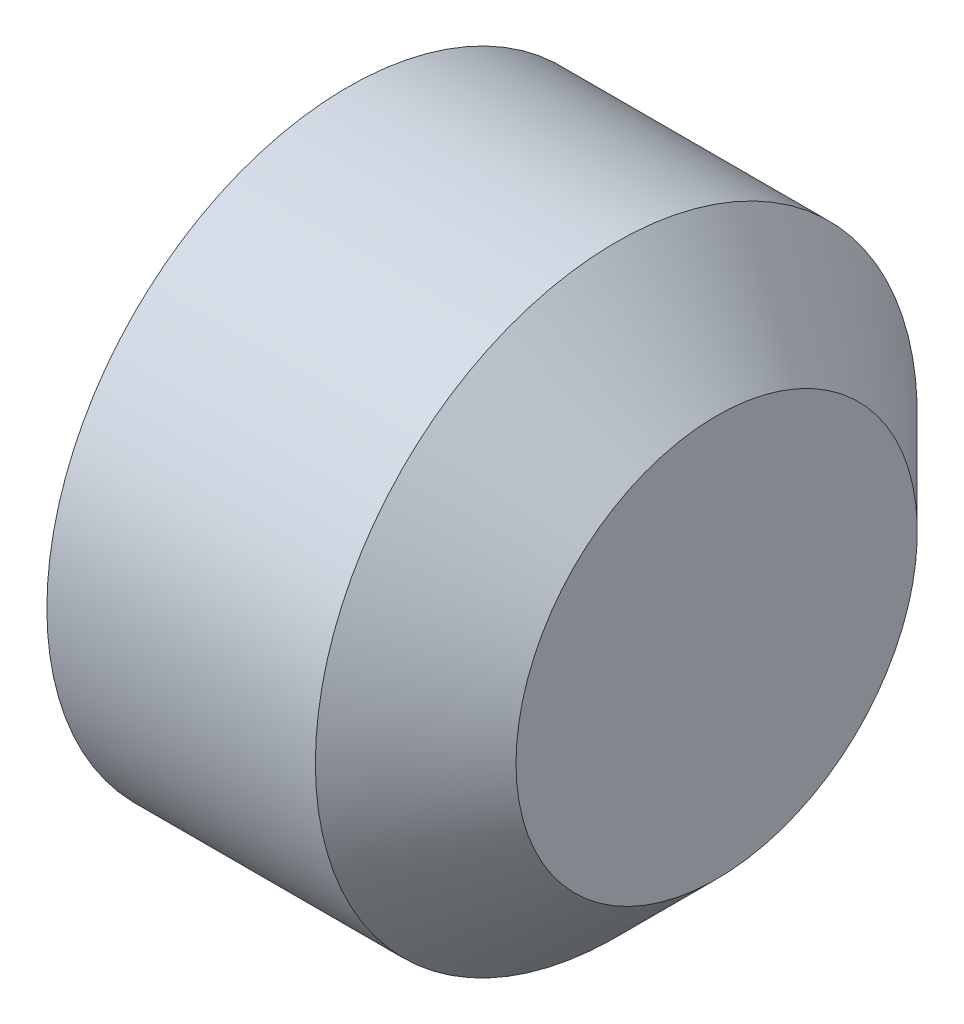
ISO-10303-21;
HEADER;
FILE_DESCRIPTION(('STEP AP214'),'2;1');
FILE_NAME('part.step','',(''),(''),'','','');
FILE_SCHEMA(('AUTOMOTIVE_DESIGN { 1 0 10303 214 1 1 1 1 }'));
ENDSEC;
DATA;
#1=APPLICATION_CONTEXT('core data for automotive mechanical design processes');
#2=APPLICATION_PROTOCOL_DEFINITION('international standard','automotive_design',2000,#1);
#3=PRODUCT_CONTEXT('',#1,'mechanical');
#4=PRODUCT('Part','Part','',(#3));
#5=PRODUCT_RELATED_PRODUCT_CATEGORY('part','',(#4));
#6=PRODUCT_DEFINITION_FORMATION('','',#4);
#7=PRODUCT_DEFINITION_CONTEXT('part definition',#1,'design');
#8=PRODUCT_DEFINITION('design','',#6,#7);
#9=PRODUCT_DEFINITION_SHAPE('','',#8);
#10=(LENGTH_UNIT() NAMED_UNIT(*) SI_UNIT(.MILLI.,.METRE.));
#11=(NAMED_UNIT(*) PLANE_ANGLE_UNIT() SI_UNIT($,.RADIAN.));
#12=(NAMED_UNIT(*) SI_UNIT($,.STERADIAN.) SOLID_ANGLE_UNIT());
#13=UNCERTAINTY_MEASURE_WITH_UNIT(LENGTH_MEASURE(1.E-05),#10,'distance_accuracy_value','');
#14=(GEOMETRIC_REPRESENTATION_CONTEXT(3) GLOBAL_UNCERTAINTY_ASSIGNED_CONTEXT((#13)) GLOBAL_UNIT_ASSIGNED_CONTEXT((#10,
#11,#12)) REPRESENTATION_CONTEXT('',''));
#15=CARTESIAN_POINT('',(0.,0.,0.));
#16=DIRECTION('',(0.,0.,1.));
#17=DIRECTION('',(1.,0.,0.));
#18=AXIS2_PLACEMENT_3D('',#15,#16,#17);
#19=CARTESIAN_POINT('',(0.,0.,0.));
#20=DIRECTION('',(-1.,0.,0.));
#21=DIRECTION('',(0.,0.,1.));
#22=AXIS2_PLACEMENT_3D('',#19,#20,#21);
#23=PLANE('',#22);
#24=CARTESIAN_POINT('',(0.,0.,0.));
#25=DIRECTION('',(-1.,0.,0.));
#26=DIRECTION('',(0.,0.,1.));
#27=AXIS2_PLACEMENT_3D('',#24,#25,#26);
#28=CIRCLE('',#27,1.2195);
#29=CARTESIAN_POINT('',(0.,0.,1.2195));
#30=VERTEX_POINT('',#29);
#31=EDGE_CURVE('E11',#30,#30,#28,.T.);
#32=ORIENTED_EDGE('',*,*,#31,.T.);
#33=EDGE_LOOP('',(#32));
#34=FACE_BOUND('',#33,.T.);
#35=DIRECTION('',(0.,0.,-1.));
#36=VECTOR('',#35,1.);
#37=CARTESIAN_POINT('',(0.,0.750000000000003,0.433012701892217));
#38=LINE('',#37,#36);
#39=CARTESIAN_POINT('',(0.,0.750000000000003,0.433012701892217));
#40=VERTEX_POINT('',#39);
#41=CARTESIAN_POINT('',(0.,0.750000000000003,-0.433012701892221));
#42=VERTEX_POINT('',#41);
#43=EDGE_CURVE('E127',#40,#42,#38,.T.);
#44=ORIENTED_EDGE('',*,*,#43,.F.);
#45=DIRECTION('',(0.,-0.866025403784439,0.5));
#46=VECTOR('',#45,1.);
#47=CARTESIAN_POINT('',(0.,0.750000000000003,0.433012701892217));
#48=LINE('',#47,#46);
#49=CARTESIAN_POINT('',(0.,0.,0.866025403784436));
#50=VERTEX_POINT('',#49);
#51=EDGE_CURVE('E49',#40,#50,#48,.T.);
#52=ORIENTED_EDGE('',*,*,#51,.T.);
#53=DIRECTION('',(0.,0.866025403784439,0.5));
#54=VECTOR('',#53,1.);
#55=CARTESIAN_POINT('',(0.,-0.749999999999997,0.433012701892217));
#56=LINE('',#55,#54);
#57=CARTESIAN_POINT('',(0.,-0.749999999999997,0.433012701892217));
#58=VERTEX_POINT('',#57);
#59=EDGE_CURVE('E118',#58,#50,#56,.T.);
#60=ORIENTED_EDGE('',*,*,#59,.F.);
#61=DIRECTION('',(0.,0.,-1.));
#62=VECTOR('',#61,1.);
#63=CARTESIAN_POINT('',(0.,-0.749999999999997,0.433012701892217));
#64=LINE('',#63,#62);
#65=CARTESIAN_POINT('',(0.,-0.749999999999997,-0.433012701892222));
#66=VERTEX_POINT('',#65);
#67=EDGE_CURVE('E121',#58,#66,#64,.T.);
#68=ORIENTED_EDGE('',*,*,#67,.T.);
#69=DIRECTION('',(0.,0.866025403784439,-0.5));
#70=VECTOR('',#69,1.);
#71=CARTESIAN_POINT('',(0.,-0.749999999999997,-0.433012701892222));
#72=LINE('',#71,#70);
#73=CARTESIAN_POINT('',(0.,0.,-0.866025403784441));
#74=VERTEX_POINT('',#73);
#75=EDGE_CURVE('E124',#66,#74,#72,.T.);
#76=ORIENTED_EDGE('',*,*,#75,.T.);
#77=DIRECTION('',(0.,-0.866025403784439,-0.5));
#78=VECTOR('',#77,1.);
#79=CARTESIAN_POINT('',(0.,0.750000000000003,-0.433012701892221));
#80=LINE('',#79,#78);
#81=EDGE_CURVE('E107',#42,#74,#80,.T.);
#82=ORIENTED_EDGE('',*,*,#81,.F.);
#83=EDGE_LOOP('',(#44,#52,#60,#68,#76,#82));
#84=FACE_BOUND('',#83,.T.);
#85=ADVANCED_FACE('F35',(#34,#84),#23,.T.);
#86=CARTESIAN_POINT('',(0.,0.,0.));
#87=DIRECTION('',(1.,0.,0.));
#88=DIRECTION('',(0.,0.,-1.));
#89=AXIS2_PLACEMENT_3D('',#86,#87,#88);
#90=CONICAL_SURFACE('',#89,1.2195,1.0471975511966);
#91=CARTESIAN_POINT('',(0.161946750507689,0.,0.));
#92=DIRECTION('',(-1.,0.,0.));
#93=DIRECTION('',(0.,0.,1.));
#94=AXIS2_PLACEMENT_3D('',#91,#92,#93);
#95=CIRCLE('',#94,1.5);
#96=CARTESIAN_POINT('',(0.161946750507689,0.,1.5));
#97=VERTEX_POINT('',#96);
#98=EDGE_CURVE('E42',#97,#97,#95,.T.);
#99=ORIENTED_EDGE('',*,*,#98,.T.);
#100=EDGE_LOOP('',(#99));
#101=FACE_BOUND('',#100,.T.);
#102=ORIENTED_EDGE('',*,*,#31,.F.);
#103=EDGE_LOOP('',(#102));
#104=FACE_BOUND('',#103,.T.);
#105=ADVANCED_FACE('F144',(#101,#104),#90,.T.);
#106=CARTESIAN_POINT('',(-12.7,0.,0.));
#107=DIRECTION('',(-1.,0.,0.));
#108=DIRECTION('',(0.,0.,1.));
#109=AXIS2_PLACEMENT_3D('',#106,#107,#108);
#110=CYLINDRICAL_SURFACE('',#109,1.5);
#111=CARTESIAN_POINT('',(1.5,0.,0.));
#112=DIRECTION('',(-1.,0.,0.));
#113=DIRECTION('',(0.,0.,1.));
#114=AXIS2_PLACEMENT_3D('',#111,#112,#113);
#115=CIRCLE('',#114,1.5);
#116=CARTESIAN_POINT('',(1.5,0.,1.5));
#117=VERTEX_POINT('',#116);
#118=EDGE_CURVE('E139',#117,#117,#115,.T.);
#119=ORIENTED_EDGE('',*,*,#118,.T.);
#120=EDGE_LOOP('',(#119));
#121=FACE_BOUND('',#120,.T.);
#122=ORIENTED_EDGE('',*,*,#98,.F.);
#123=EDGE_LOOP('',(#122));
#124=FACE_BOUND('',#123,.T.);
#125=ADVANCED_FACE('F147',(#121,#124),#110,.T.);
#126=CARTESIAN_POINT('',(1.5,0.,0.));
#127=DIRECTION('',(-1.,0.,0.));
#128=DIRECTION('',(0.,0.,1.));
#129=AXIS2_PLACEMENT_3D('',#126,#127,#128);
#130=CONICAL_SURFACE('',#129,1.5,0.785398163397446);
#131=CARTESIAN_POINT('',(2.,0.,0.));
#132=DIRECTION('',(-1.,0.,0.));
#133=DIRECTION('',(0.,0.,1.));
#134=AXIS2_PLACEMENT_3D('',#131,#132,#133);
#135=CIRCLE('',#134,1.);
#136=CARTESIAN_POINT('',(2.,0.,1.));
#137=VERTEX_POINT('',#136);
#138=EDGE_CURVE('E136',#137,#137,#135,.T.);
#139=ORIENTED_EDGE('',*,*,#138,.T.);
#140=EDGE_LOOP('',(#139));
#141=FACE_BOUND('',#140,.T.);
#142=ORIENTED_EDGE('',*,*,#118,.F.);
#143=EDGE_LOOP('',(#142));
#144=FACE_BOUND('',#143,.T.);
#145=ADVANCED_FACE('F149',(#141,#144),#130,.T.);
#146=CARTESIAN_POINT('',(2.,1.,0.));
#147=DIRECTION('',(1.,0.,0.));
#148=DIRECTION('',(0.,0.,-1.));
#149=AXIS2_PLACEMENT_3D('',#146,#147,#148);
#150=PLANE('',#149);
#151=ORIENTED_EDGE('',*,*,#138,.F.);
#152=EDGE_LOOP('',(#151));
#153=FACE_BOUND('',#152,.T.);
#154=ADVANCED_FACE('F156',(#153),#150,.T.);
#155=CARTESIAN_POINT('',(1.2,0.750000000000003,0.433012701892217));
#156=DIRECTION('',(0.,-0.5,-0.866025403784439));
#157=DIRECTION('',(0.,0.866025403784439,-0.5));
#158=AXIS2_PLACEMENT_3D('',#155,#156,#157);
#159=PLANE('',#158);
#160=ORIENTED_EDGE('',*,*,#51,.F.);
#161=DIRECTION('',(-1.,0.,0.));
#162=VECTOR('',#161,1.);
#163=CARTESIAN_POINT('',(1.2,0.750000000000003,0.433012701892217));
#164=LINE('',#163,#162);
#165=CARTESIAN_POINT('',(1.2,0.750000000000003,0.433012701892217));
#166=VERTEX_POINT('',#165);
#167=EDGE_CURVE('E54',#166,#40,#164,.T.);
#168=ORIENTED_EDGE('',*,*,#167,.F.);
#169=DIRECTION('',(0.,-0.866025403784439,0.5));
#170=VECTOR('',#169,1.);
#171=CARTESIAN_POINT('',(1.2,0.750000000000003,0.433012701892217));
#172=LINE('',#171,#170);
#173=CARTESIAN_POINT('',(1.2,0.,0.866025403784436));
#174=VERTEX_POINT('',#173);
#175=EDGE_CURVE('E81',#166,#174,#172,.T.);
#176=ORIENTED_EDGE('',*,*,#175,.T.);
#177=DIRECTION('',(-1.,0.,0.));
#178=VECTOR('',#177,1.);
#179=CARTESIAN_POINT('',(1.2,0.,0.866025403784436));
#180=LINE('',#179,#178);
#181=EDGE_CURVE('E134',#174,#50,#180,.T.);
#182=ORIENTED_EDGE('',*,*,#181,.T.);
#183=EDGE_LOOP('',(#160,#168,#176,#182));
#184=FACE_BOUND('',#183,.T.);
#185=ADVANCED_FACE('F187',(#184),#159,.T.);
#186=CARTESIAN_POINT('',(1.2,-0.749999999999997,0.433012701892217));
#187=DIRECTION('',(0.,-0.5,0.866025403784439));
#188=DIRECTION('',(0.,-0.866025403784439,-0.5));
#189=AXIS2_PLACEMENT_3D('',#186,#187,#188);
#190=PLANE('',#189);
#191=ORIENTED_EDGE('',*,*,#59,.T.);
#192=ORIENTED_EDGE('',*,*,#181,.F.);
#193=DIRECTION('',(0.,0.866025403784439,0.5));
#194=VECTOR('',#193,1.);
#195=CARTESIAN_POINT('',(1.2,-0.749999999999997,0.433012701892217));
#196=LINE('',#195,#194);
#197=CARTESIAN_POINT('',(1.2,-0.749999999999997,0.433012701892217));
#198=VERTEX_POINT('',#197);
#199=EDGE_CURVE('E267',#198,#174,#196,.T.);
#200=ORIENTED_EDGE('',*,*,#199,.F.);
#201=DIRECTION('',(-1.,0.,0.));
#202=VECTOR('',#201,1.);
#203=CARTESIAN_POINT('',(1.2,-0.749999999999997,0.433012701892217));
#204=LINE('',#203,#202);
#205=EDGE_CURVE('E132',#198,#58,#204,.T.);
#206=ORIENTED_EDGE('',*,*,#205,.T.);
#207=EDGE_LOOP('',(#191,#192,#200,#206));
#208=FACE_BOUND('',#207,.T.);
#209=ADVANCED_FACE('F183',(#208),#190,.F.);
#210=CARTESIAN_POINT('',(1.2,-0.749999999999997,0.433012701892217));
#211=DIRECTION('',(0.,1.,0.));
#212=DIRECTION('',(0.,0.,1.));
#213=AXIS2_PLACEMENT_3D('',#210,#211,#212);
#214=PLANE('',#213);
#215=ORIENTED_EDGE('',*,*,#67,.F.);
#216=ORIENTED_EDGE('',*,*,#205,.F.);
#217=DIRECTION('',(0.,0.,-1.));
#218=VECTOR('',#217,1.);
#219=CARTESIAN_POINT('',(1.2,-0.749999999999997,0.433012701892217));
#220=LINE('',#219,#218);
#221=CARTESIAN_POINT('',(1.2,-0.749999999999997,-0.433012701892222));
#222=VERTEX_POINT('',#221);
#223=EDGE_CURVE('E102',#198,#222,#220,.T.);
#224=ORIENTED_EDGE('',*,*,#223,.T.);
#225=DIRECTION('',(-1.,0.,0.));
#226=VECTOR('',#225,1.);
#227=CARTESIAN_POINT('',(1.2,-0.749999999999997,-0.433012701892222));
#228=LINE('',#227,#226);
#229=EDGE_CURVE('E97',#222,#66,#228,.T.);
#230=ORIENTED_EDGE('',*,*,#229,.T.);
#231=EDGE_LOOP('',(#215,#216,#224,#230));
#232=FACE_BOUND('',#231,.T.);
#233=ADVANCED_FACE('F180',(#232),#214,.T.);
#234=CARTESIAN_POINT('',(1.2,-0.749999999999997,-0.433012701892222));
#235=DIRECTION('',(0.,0.5,0.866025403784439));
#236=DIRECTION('',(0.,-0.866025403784439,0.5));
#237=AXIS2_PLACEMENT_3D('',#234,#235,#236);
#238=PLANE('',#237);
#239=ORIENTED_EDGE('',*,*,#75,.F.);
#240=ORIENTED_EDGE('',*,*,#229,.F.);
#241=DIRECTION('',(0.,0.866025403784439,-0.5));
#242=VECTOR('',#241,1.);
#243=CARTESIAN_POINT('',(1.2,-0.749999999999997,-0.433012701892222));
#244=LINE('',#243,#242);
#245=CARTESIAN_POINT('',(1.2,0.,-0.866025403784441));
#246=VERTEX_POINT('',#245);
#247=EDGE_CURVE('E92',#222,#246,#244,.T.);
#248=ORIENTED_EDGE('',*,*,#247,.T.);
#249=DIRECTION('',(-1.,0.,0.));
#250=VECTOR('',#249,1.);
#251=CARTESIAN_POINT('',(1.2,0.,-0.866025403784441));
#252=LINE('',#251,#250);
#253=EDGE_CURVE('E96',#246,#74,#252,.T.);
#254=ORIENTED_EDGE('',*,*,#253,.T.);
#255=EDGE_LOOP('',(#239,#240,#248,#254));
#256=FACE_BOUND('',#255,.T.);
#257=ADVANCED_FACE('F95',(#256),#238,.T.);
#258=CARTESIAN_POINT('',(1.2,0.750000000000003,-0.433012701892221));
#259=DIRECTION('',(0.,0.5,-0.866025403784439));
#260=DIRECTION('',(0.,0.866025403784439,0.5));
#261=AXIS2_PLACEMENT_3D('',#258,#259,#260);
#262=PLANE('',#261);
#263=ORIENTED_EDGE('',*,*,#81,.T.);
#264=ORIENTED_EDGE('',*,*,#253,.F.);
#265=DIRECTION('',(0.,-0.866025403784439,-0.5));
#266=VECTOR('',#265,1.);
#267=CARTESIAN_POINT('',(1.2,0.750000000000003,-0.433012701892221));
#268=LINE('',#267,#266);
#269=CARTESIAN_POINT('',(1.2,0.750000000000003,-0.433012701892221));
#270=VERTEX_POINT('',#269);
#271=EDGE_CURVE('E101',#270,#246,#268,.T.);
#272=ORIENTED_EDGE('',*,*,#271,.F.);
#273=DIRECTION('',(-1.,0.,0.));
#274=VECTOR('',#273,1.);
#275=CARTESIAN_POINT('',(1.2,0.750000000000003,-0.433012701892221));
#276=LINE('',#275,#274);
#277=EDGE_CURVE('E77',#270,#42,#276,.T.);
#278=ORIENTED_EDGE('',*,*,#277,.T.);
#279=EDGE_LOOP('',(#263,#264,#272,#278));
#280=FACE_BOUND('',#279,.T.);
#281=ADVANCED_FACE('F104',(#280),#262,.F.);
#282=CARTESIAN_POINT('',(1.2,0.750000000000003,0.433012701892217));
#283=DIRECTION('',(0.,1.,0.));
#284=DIRECTION('',(0.,0.,1.));
#285=AXIS2_PLACEMENT_3D('',#282,#283,#284);
#286=PLANE('',#285);
#287=ORIENTED_EDGE('',*,*,#43,.T.);
#288=ORIENTED_EDGE('',*,*,#277,.F.);
#289=DIRECTION('',(0.,0.,-1.));
#290=VECTOR('',#289,1.);
#291=CARTESIAN_POINT('',(1.2,0.750000000000003,0.433012701892217));
#292=LINE('',#291,#290);
#293=EDGE_CURVE('E112',#166,#270,#292,.T.);
#294=ORIENTED_EDGE('',*,*,#293,.F.);
#295=ORIENTED_EDGE('',*,*,#167,.T.);
#296=EDGE_LOOP('',(#287,#288,#294,#295));
#297=FACE_BOUND('',#296,.T.);
#298=ADVANCED_FACE('F168',(#297),#286,.F.);
#299=CARTESIAN_POINT('',(1.2,0.750000000000003,0.433012701892217));
#300=DIRECTION('',(1.,0.,0.));
#301=DIRECTION('',(0.,0.,-1.));
#302=AXIS2_PLACEMENT_3D('',#299,#300,#301);
#303=PLANE('',#302);
#304=ORIENTED_EDGE('',*,*,#175,.F.);
#305=ORIENTED_EDGE('',*,*,#293,.T.);
#306=ORIENTED_EDGE('',*,*,#271,.T.);
#307=ORIENTED_EDGE('',*,*,#247,.F.);
#308=ORIENTED_EDGE('',*,*,#223,.F.);
#309=ORIENTED_EDGE('',*,*,#199,.T.);
#310=EDGE_LOOP('',(#304,#305,#306,#307,#308,#309));
#311=FACE_BOUND('',#310,.T.);
#312=ADVANCED_FACE('F110',(#311),#303,.F.);
#313=CLOSED_SHELL('',(#85,#105,#125,#145,#154,#185,#209,#233,#257,#281,#298,#312));
#314=MANIFOLD_SOLID_BREP('B2',#313);
#315=ADVANCED_BREP_SHAPE_REPRESENTATION('',(#18,#314),#14);
#316=SHAPE_DEFINITION_REPRESENTATION(#9,#315);
ENDSEC;
END-ISO-10303-21;
